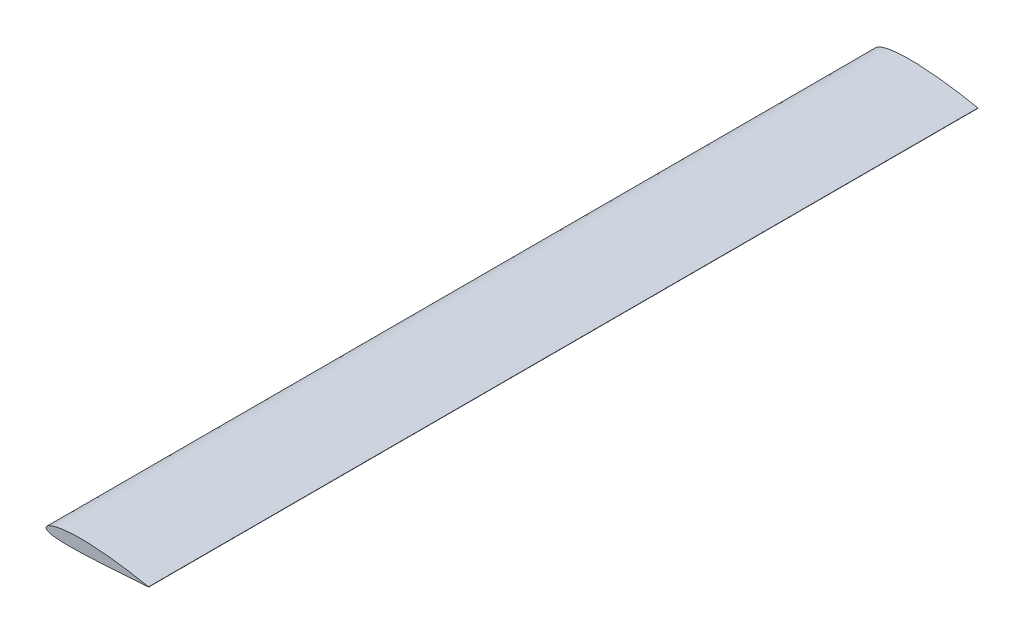
ISO-10303-21;
HEADER;
FILE_DESCRIPTION(('STEP AP214'),'2;1');
FILE_NAME('part.step','',(''),(''),'','','');
FILE_SCHEMA(('AUTOMOTIVE_DESIGN { 1 0 10303 214 1 1 1 1 }'));
ENDSEC;
DATA;
#1=APPLICATION_CONTEXT('core data for automotive mechanical design processes');
#2=APPLICATION_PROTOCOL_DEFINITION('international standard','automotive_design',2000,#1);
#3=PRODUCT_CONTEXT('',#1,'mechanical');
#4=PRODUCT('Part','Part','',(#3));
#5=PRODUCT_RELATED_PRODUCT_CATEGORY('part','',(#4));
#6=PRODUCT_DEFINITION_FORMATION('','',#4);
#7=PRODUCT_DEFINITION_CONTEXT('part definition',#1,'design');
#8=PRODUCT_DEFINITION('design','',#6,#7);
#9=PRODUCT_DEFINITION_SHAPE('','',#8);
#10=(LENGTH_UNIT() NAMED_UNIT(*) SI_UNIT(.MILLI.,.METRE.));
#11=(NAMED_UNIT(*) PLANE_ANGLE_UNIT() SI_UNIT($,.RADIAN.));
#12=(NAMED_UNIT(*) SI_UNIT($,.STERADIAN.) SOLID_ANGLE_UNIT());
#13=UNCERTAINTY_MEASURE_WITH_UNIT(LENGTH_MEASURE(1.E-05),#10,'distance_accuracy_value','');
#14=(GEOMETRIC_REPRESENTATION_CONTEXT(3) GLOBAL_UNCERTAINTY_ASSIGNED_CONTEXT((#13)) GLOBAL_UNIT_ASSIGNED_CONTEXT((#10,
#11,#12)) REPRESENTATION_CONTEXT('',''));
#15=CARTESIAN_POINT('',(0.,0.,0.));
#16=DIRECTION('',(0.,0.,1.));
#17=DIRECTION('',(1.,0.,0.));
#18=AXIS2_PLACEMENT_3D('',#15,#16,#17);
#19=CARTESIAN_POINT('',(350.,0.455,1415.));
#20=CARTESIAN_POINT('',(344.169902064128,1.64966676228195,1415.));
#21=CARTESIAN_POINT('',(332.525018485696,4.03586258863283,1415.));
#22=CARTESIAN_POINT('',(309.215253325889,8.40650922258904,1415.));
#23=CARTESIAN_POINT('',(280.062345554572,13.2491892988711,1415.));
#24=CARTESIAN_POINT('',(245.055704655549,18.2612450750222,1415.));
#25=CARTESIAN_POINT('',(210.054838401487,22.4411143904733,1415.));
#26=CARTESIAN_POINT('',(175.038797911054,25.5016772656284,1415.));
#27=CARTESIAN_POINT('',(140.030731770657,27.5742800768441,1415.));
#28=CARTESIAN_POINT('',(110.822441983491,27.9251098082377,1415.));
#29=CARTESIAN_POINT('',(87.4788313858653,26.958710007529,1415.));
#30=CARTESIAN_POINT('',(69.9568079413784,25.5426550372799,1415.));
#31=CARTESIAN_POINT('',(52.4126631396048,23.300239865392,1415.));
#32=CARTESIAN_POINT('',(37.8115724065868,20.5388790374974,1415.));
#33=CARTESIAN_POINT('',(26.1712963300949,17.41480294916,1415.));
#34=CARTESIAN_POINT('',(17.3463231374763,14.574555652946,1415.));
#35=CARTESIAN_POINT('',(9.86938163143657,11.2652409584717,1415.));
#36=CARTESIAN_POINT('',(3.41983948499166,7.25306295912349,1415.));
#37=CARTESIAN_POINT('',(-2.20438013694359,0.314569912588471,1415.));
#38=CARTESIAN_POINT('',(3.63768554229126,-5.78424023138462,1415.));
#39=CARTESIAN_POINT('',(9.96659040462357,-8.56585364322993,1415.));
#40=CARTESIAN_POINT('',(17.4106372865384,-10.6787840668744,1415.));
#41=CARTESIAN_POINT('',(26.2065562191633,-12.1937608884784,1415.));
#42=CARTESIAN_POINT('',(37.8934189616109,-13.4866248506164,1415.));
#43=CARTESIAN_POINT('',(52.4814609218151,-14.4817255010246,1415.));
#44=CARTESIAN_POINT('',(69.9979392250345,-14.8806906645106,1415.));
#45=CARTESIAN_POINT('',(87.5019160129826,-14.8250935284752,1415.));
#46=CARTESIAN_POINT('',(110.83741143429,-14.3099992352046,1415.));
#47=CARTESIAN_POINT('',(140.00950370755,-13.3831167945426,1415.));
#48=CARTESIAN_POINT('',(175.011686204452,-11.7700604533614,1415.));
#49=CARTESIAN_POINT('',(210.003719140474,-9.67348795958229,1415.));
#50=CARTESIAN_POINT('',(245.001687049279,-7.49426870185587,1415.));
#51=CARTESIAN_POINT('',(280.00563900681,-5.28842819602031,1415.));
#52=CARTESIAN_POINT('',(309.166001397936,-3.25685875942877,1415.));
#53=CARTESIAN_POINT('',(332.501484145654,-1.68987206778404,1415.));
#54=CARTESIAN_POINT('',(344.166894349059,-0.866642867128712,1415.));
#55=CARTESIAN_POINT('',(350.,-0.455,1415.));
#56=B_SPLINE_CURVE_WITH_KNOTS('',3,(#19,#20,#21,#22,#23,#24,#25,#26,#27,#28,#29,#30,#31,#32,#33,
#34,#35,#36,#37,#38,#39,#40,#41,#42,#43,#44,#45,#46,#47,#48,#49,#50,#51,#52,#53,#54,#55),
.UNSPECIFIED.,.F.,.F.,(4,1,1,1,1,1,1,1,1,1,1,1,1,1,1,1,1,1,1,1,1,1,1,1,1,1,1,1,1,1,1,1,1,1,4),
(0.,0.0250124897498648,0.0499592861642578,0.0996729249269685,0.149206319909966,
0.198581096615965,0.247805170456832,0.296916574601493,0.345952721793533,0.37049162556991,
0.395091203654929,0.41981479582396,0.444798575016595,0.457489818915221,0.470406405435489,
0.483879408669829,0.491264120322896,0.503458853294664,0.513609129403887,0.520450990700287,
0.533235387615153,0.545691039147803,0.558031884237173,0.582609167247894,0.607134741746914,
0.631652079836766,0.656174271859652,0.705233949250519,0.754320378530032,0.803437363555032,
0.852566095729537,0.901700994033254,0.95084880933727,0.975422716989278,1.),.UNSPECIFIED.);
#57=DIRECTION('',(0.,0.,-1.));
#58=VECTOR('',#57,1.);
#59=SURFACE_OF_LINEAR_EXTRUSION('',#56,#58);
#60=DIRECTION('',(0.,0.,-1.));
#61=VECTOR('',#60,1.);
#62=CARTESIAN_POINT('',(350.,0.455,1415.));
#63=LINE('',#62,#61);
#64=CARTESIAN_POINT('',(350.,0.455,1415.));
#65=VERTEX_POINT('',#64);
#66=CARTESIAN_POINT('',(350.,0.455,-1415.));
#67=VERTEX_POINT('',#66);
#68=EDGE_CURVE('E41',#65,#67,#63,.T.);
#69=ORIENTED_EDGE('',*,*,#68,.T.);
#70=CARTESIAN_POINT('',(350.,0.455,-1415.));
#71=CARTESIAN_POINT('',(344.169902064128,1.64966676228195,-1415.));
#72=CARTESIAN_POINT('',(332.525018485696,4.03586258863283,-1415.));
#73=CARTESIAN_POINT('',(309.215253325889,8.40650922258904,-1415.));
#74=CARTESIAN_POINT('',(280.062345554572,13.2491892988711,-1415.));
#75=CARTESIAN_POINT('',(245.055704655549,18.2612450750222,-1415.));
#76=CARTESIAN_POINT('',(210.054838401487,22.4411143904733,-1415.));
#77=CARTESIAN_POINT('',(175.038797911054,25.5016772656284,-1415.));
#78=CARTESIAN_POINT('',(140.030731770657,27.5742800768441,-1415.));
#79=CARTESIAN_POINT('',(110.822441983491,27.9251098082377,-1415.));
#80=CARTESIAN_POINT('',(87.4788313858653,26.958710007529,-1415.));
#81=CARTESIAN_POINT('',(69.9568079413784,25.5426550372799,-1415.));
#82=CARTESIAN_POINT('',(52.4126631396048,23.300239865392,-1415.));
#83=CARTESIAN_POINT('',(37.8115724065868,20.5388790374974,-1415.));
#84=CARTESIAN_POINT('',(26.1712963300949,17.41480294916,-1415.));
#85=CARTESIAN_POINT('',(17.3463231374763,14.574555652946,-1415.));
#86=CARTESIAN_POINT('',(9.86938163143657,11.2652409584717,-1415.));
#87=CARTESIAN_POINT('',(3.41983948499166,7.25306295912349,-1415.));
#88=CARTESIAN_POINT('',(-2.20438013694359,0.314569912588471,-1415.));
#89=CARTESIAN_POINT('',(3.63768554229126,-5.78424023138462,-1415.));
#90=CARTESIAN_POINT('',(9.96659040462357,-8.56585364322993,-1415.));
#91=CARTESIAN_POINT('',(17.4106372865384,-10.6787840668744,-1415.));
#92=CARTESIAN_POINT('',(26.2065562191633,-12.1937608884784,-1415.));
#93=CARTESIAN_POINT('',(37.8934189616109,-13.4866248506164,-1415.));
#94=CARTESIAN_POINT('',(52.4814609218151,-14.4817255010246,-1415.));
#95=CARTESIAN_POINT('',(69.9979392250345,-14.8806906645106,-1415.));
#96=CARTESIAN_POINT('',(87.5019160129826,-14.8250935284752,-1415.));
#97=CARTESIAN_POINT('',(110.83741143429,-14.3099992352046,-1415.));
#98=CARTESIAN_POINT('',(140.00950370755,-13.3831167945426,-1415.));
#99=CARTESIAN_POINT('',(175.011686204452,-11.7700604533614,-1415.));
#100=CARTESIAN_POINT('',(210.003719140474,-9.67348795958229,-1415.));
#101=CARTESIAN_POINT('',(245.001687049279,-7.49426870185587,-1415.));
#102=CARTESIAN_POINT('',(280.00563900681,-5.28842819602031,-1415.));
#103=CARTESIAN_POINT('',(309.166001397936,-3.25685875942877,-1415.));
#104=CARTESIAN_POINT('',(332.501484145654,-1.68987206778404,-1415.));
#105=CARTESIAN_POINT('',(344.166894349059,-0.866642867128712,-1415.));
#106=CARTESIAN_POINT('',(350.,-0.455,-1415.));
#107=B_SPLINE_CURVE_WITH_KNOTS('',3,(#70,#71,#72,#73,#74,#75,#76,#77,#78,#79,#80,#81,#82,#83,
#84,#85,#86,#87,#88,#89,#90,#91,#92,#93,#94,#95,#96,#97,#98,#99,#100,#101,#102,#103,#104,#105,
#106),.UNSPECIFIED.,.F.,.F.,(4,1,1,1,1,1,1,1,1,1,1,1,1,1,1,1,1,1,1,1,1,1,1,1,1,1,1,1,1,1,1,1,1,
1,4),(0.,0.0250124897498648,0.0499592861642578,0.0996729249269685,0.149206319909966,
0.198581096615965,0.247805170456832,0.296916574601493,0.345952721793533,0.37049162556991,
0.395091203654929,0.41981479582396,0.444798575016595,0.457489818915221,0.470406405435489,
0.483879408669829,0.491264120322896,0.503458853294664,0.513609129403887,0.520450990700287,
0.533235387615153,0.545691039147803,0.558031884237173,0.582609167247894,0.607134741746914,
0.631652079836766,0.656174271859652,0.705233949250519,0.754320378530032,0.803437363555032,
0.852566095729537,0.901700994033254,0.95084880933727,0.975422716989278,1.),.UNSPECIFIED.);
#108=CARTESIAN_POINT('',(350.,-0.455,-1415.));
#109=VERTEX_POINT('',#108);
#110=EDGE_CURVE('E60',#67,#109,#107,.T.);
#111=ORIENTED_EDGE('',*,*,#110,.T.);
#112=DIRECTION('',(0.,0.,-1.));
#113=VECTOR('',#112,1.);
#114=CARTESIAN_POINT('',(350.,-0.455,1415.));
#115=LINE('',#114,#113);
#116=CARTESIAN_POINT('',(350.,-0.455,1415.));
#117=VERTEX_POINT('',#116);
#118=EDGE_CURVE('E11',#117,#109,#115,.T.);
#119=ORIENTED_EDGE('',*,*,#118,.F.);
#120=EDGE_CURVE('E62',#65,#117,#56,.T.);
#121=ORIENTED_EDGE('',*,*,#120,.F.);
#122=EDGE_LOOP('',(#69,#111,#119,#121));
#123=FACE_BOUND('',#122,.T.);
#124=ADVANCED_FACE('F33',(#123),#59,.F.);
#125=CARTESIAN_POINT('',(350.,0.455,1415.));
#126=DIRECTION('',(-1.,0.,0.));
#127=DIRECTION('',(0.,-1.,0.));
#128=AXIS2_PLACEMENT_3D('',#125,#126,#127);
#129=PLANE('',#128);
#130=ORIENTED_EDGE('',*,*,#118,.T.);
#131=DIRECTION('',(0.,1.,0.));
#132=VECTOR('',#131,1.);
#133=CARTESIAN_POINT('',(350.,0.455,-1415.));
#134=LINE('',#133,#132);
#135=EDGE_CURVE('E66',#109,#67,#134,.T.);
#136=ORIENTED_EDGE('',*,*,#135,.T.);
#137=ORIENTED_EDGE('',*,*,#68,.F.);
#138=DIRECTION('',(0.,1.,0.));
#139=VECTOR('',#138,1.);
#140=CARTESIAN_POINT('',(350.,0.455,1415.));
#141=LINE('',#140,#139);
#142=EDGE_CURVE('E47',#117,#65,#141,.T.);
#143=ORIENTED_EDGE('',*,*,#142,.F.);
#144=EDGE_LOOP('',(#130,#136,#137,#143));
#145=FACE_BOUND('',#144,.T.);
#146=ADVANCED_FACE('F68',(#145),#129,.F.);
#147=CARTESIAN_POINT('',(0.32547106139112,2.29952085468247,1415.));
#148=DIRECTION('',(0.,0.,-1.));
#149=DIRECTION('',(-1.,0.,0.));
#150=AXIS2_PLACEMENT_3D('',#147,#148,#149);
#151=PLANE('',#150);
#152=ORIENTED_EDGE('',*,*,#120,.T.);
#153=ORIENTED_EDGE('',*,*,#142,.T.);
#154=EDGE_LOOP('',(#152,#153));
#155=FACE_BOUND('',#154,.T.);
#156=ADVANCED_FACE('F82',(#155),#151,.F.);
#157=CARTESIAN_POINT('',(0.32547106139112,2.29952085468247,-1415.));
#158=DIRECTION('',(0.,0.,1.));
#159=DIRECTION('',(-1.,0.,0.));
#160=AXIS2_PLACEMENT_3D('',#157,#158,#159);
#161=PLANE('',#160);
#162=ORIENTED_EDGE('',*,*,#110,.F.);
#163=ORIENTED_EDGE('',*,*,#135,.F.);
#164=EDGE_LOOP('',(#162,#163));
#165=FACE_BOUND('',#164,.T.);
#166=ADVANCED_FACE('F65',(#165),#161,.F.);
#167=CLOSED_SHELL('',(#124,#146,#156,#166));
#168=MANIFOLD_SOLID_BREP('B2',#167);
#169=ADVANCED_BREP_SHAPE_REPRESENTATION('',(#18,#168),#14);
#170=SHAPE_DEFINITION_REPRESENTATION(#9,#169);
ENDSEC;
END-ISO-10303-21;
